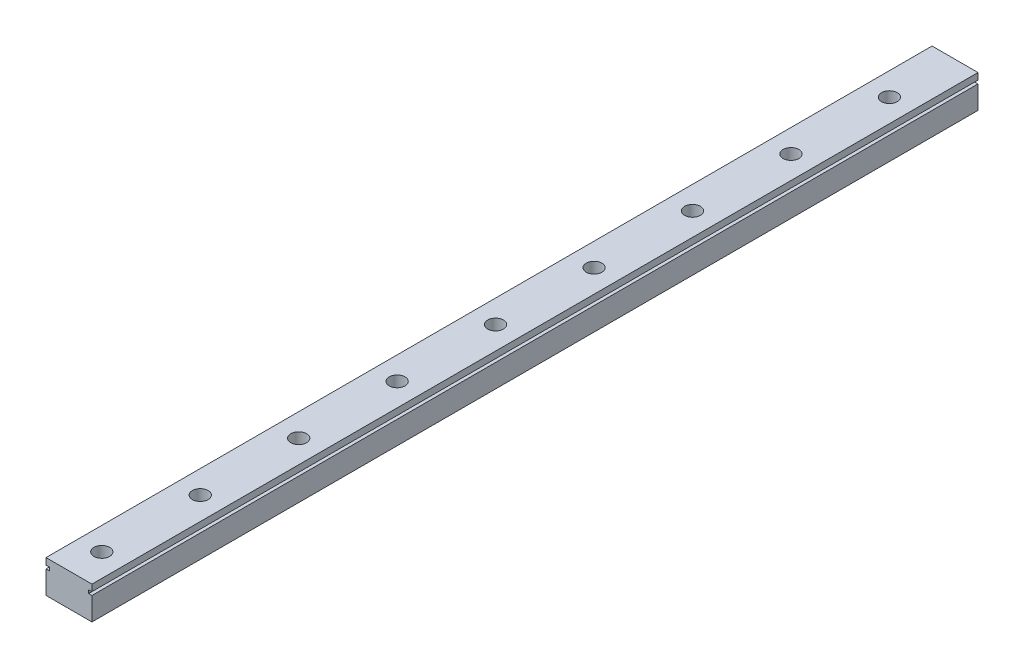
ISO-10303-21;
HEADER;
FILE_DESCRIPTION(('STEP AP214'),'2;1');
FILE_NAME('part.step','',(''),(''),'','','');
FILE_SCHEMA(('AUTOMOTIVE_DESIGN { 1 0 10303 214 1 1 1 1 }'));
ENDSEC;
DATA;
#1=APPLICATION_CONTEXT('core data for automotive mechanical design processes');
#2=APPLICATION_PROTOCOL_DEFINITION('international standard','automotive_design',2000,#1);
#3=PRODUCT_CONTEXT('',#1,'mechanical');
#4=PRODUCT('Part','Part','',(#3));
#5=PRODUCT_RELATED_PRODUCT_CATEGORY('part','',(#4));
#6=PRODUCT_DEFINITION_FORMATION('','',#4);
#7=PRODUCT_DEFINITION_CONTEXT('part definition',#1,'design');
#8=PRODUCT_DEFINITION('design','',#6,#7);
#9=PRODUCT_DEFINITION_SHAPE('','',#8);
#10=(LENGTH_UNIT() NAMED_UNIT(*) SI_UNIT(.MILLI.,.METRE.));
#11=(NAMED_UNIT(*) PLANE_ANGLE_UNIT() SI_UNIT($,.RADIAN.));
#12=(NAMED_UNIT(*) SI_UNIT($,.STERADIAN.) SOLID_ANGLE_UNIT());
#13=UNCERTAINTY_MEASURE_WITH_UNIT(LENGTH_MEASURE(1.E-05),#10,'distance_accuracy_value','');
#14=(GEOMETRIC_REPRESENTATION_CONTEXT(3) GLOBAL_UNCERTAINTY_ASSIGNED_CONTEXT((#13)) GLOBAL_UNIT_ASSIGNED_CONTEXT((#10,
#11,#12)) REPRESENTATION_CONTEXT('',''));
#15=CARTESIAN_POINT('',(0.,0.,0.));
#16=DIRECTION('',(0.,0.,1.));
#17=DIRECTION('',(1.,0.,0.));
#18=AXIS2_PLACEMENT_3D('',#15,#16,#17);
#19=CARTESIAN_POINT('',(0.,0.,135.));
#20=DIRECTION('',(1.,0.,0.));
#21=DIRECTION('',(0.,1.,0.));
#22=AXIS2_PLACEMENT_3D('',#19,#20,#21);
#23=PLANE('',#22);
#24=DIRECTION('',(0.,-1.,0.));
#25=VECTOR('',#24,1.);
#26=CARTESIAN_POINT('',(0.,0.,0.));
#27=LINE('',#26,#25);
#28=CARTESIAN_POINT('',(0.,3.5,0.));
#29=VERTEX_POINT('',#28);
#30=CARTESIAN_POINT('',(0.,0.,0.));
#31=VERTEX_POINT('',#30);
#32=EDGE_CURVE('E153',#29,#31,#27,.T.);
#33=ORIENTED_EDGE('',*,*,#32,.T.);
#34=DIRECTION('',(0.,0.,-1.));
#35=VECTOR('',#34,1.);
#36=CARTESIAN_POINT('',(0.,0.,135.));
#37=LINE('',#36,#35);
#38=CARTESIAN_POINT('',(0.,0.,135.));
#39=VERTEX_POINT('',#38);
#40=EDGE_CURVE('E11',#39,#31,#37,.T.);
#41=ORIENTED_EDGE('',*,*,#40,.F.);
#42=DIRECTION('',(0.,-1.,0.));
#43=VECTOR('',#42,1.);
#44=CARTESIAN_POINT('',(0.,0.,135.));
#45=LINE('',#44,#43);
#46=CARTESIAN_POINT('',(0.,3.5,135.));
#47=VERTEX_POINT('',#46);
#48=EDGE_CURVE('E176',#47,#39,#45,.T.);
#49=ORIENTED_EDGE('',*,*,#48,.F.);
#50=DIRECTION('',(0.,0.,-1.));
#51=VECTOR('',#50,1.);
#52=CARTESIAN_POINT('',(0.,3.5,135.));
#53=LINE('',#52,#51);
#54=EDGE_CURVE('E149',#47,#29,#53,.T.);
#55=ORIENTED_EDGE('',*,*,#54,.T.);
#56=EDGE_LOOP('',(#33,#41,#49,#55));
#57=FACE_BOUND('',#56,.T.);
#58=ADVANCED_FACE('F33',(#57),#23,.F.);
#59=CARTESIAN_POINT('',(0.,0.,135.));
#60=DIRECTION('',(0.,1.,0.));
#61=DIRECTION('',(0.,0.,1.));
#62=AXIS2_PLACEMENT_3D('',#59,#60,#61);
#63=PLANE('',#62);
#64=CARTESIAN_POINT('',(3.49999999999958,0.,10.));
#65=DIRECTION('',(0.,1.,0.));
#66=DIRECTION('',(0.,0.,1.));
#67=AXIS2_PLACEMENT_3D('',#64,#65,#66);
#68=CIRCLE('',#67,1.2);
#69=CARTESIAN_POINT('',(3.49999999999958,0.,11.2000000000001));
#70=VERTEX_POINT('',#69);
#71=EDGE_CURVE('E419',#70,#70,#68,.T.);
#72=ORIENTED_EDGE('',*,*,#71,.T.);
#73=EDGE_LOOP('',(#72));
#74=FACE_BOUND('',#73,.T.);
#75=CARTESIAN_POINT('',(3.49999999999963,0.,25.));
#76=DIRECTION('',(0.,1.,0.));
#77=DIRECTION('',(0.,0.,1.));
#78=AXIS2_PLACEMENT_3D('',#75,#76,#77);
#79=CIRCLE('',#78,1.2);
#80=CARTESIAN_POINT('',(3.49999999999963,0.,26.2));
#81=VERTEX_POINT('',#80);
#82=EDGE_CURVE('E427',#81,#81,#79,.T.);
#83=ORIENTED_EDGE('',*,*,#82,.T.);
#84=EDGE_LOOP('',(#83));
#85=FACE_BOUND('',#84,.T.);
#86=CARTESIAN_POINT('',(3.49999999999969,0.,40.));
#87=DIRECTION('',(0.,1.,0.));
#88=DIRECTION('',(0.,0.,1.));
#89=AXIS2_PLACEMENT_3D('',#86,#87,#88);
#90=CIRCLE('',#89,1.2);
#91=CARTESIAN_POINT('',(3.49999999999969,0.,41.2));
#92=VERTEX_POINT('',#91);
#93=EDGE_CURVE('E433',#92,#92,#90,.T.);
#94=ORIENTED_EDGE('',*,*,#93,.T.);
#95=EDGE_LOOP('',(#94));
#96=FACE_BOUND('',#95,.T.);
#97=CARTESIAN_POINT('',(3.49999999999974,0.,55.));
#98=DIRECTION('',(0.,1.,0.));
#99=DIRECTION('',(0.,0.,1.));
#100=AXIS2_PLACEMENT_3D('',#97,#98,#99);
#101=CIRCLE('',#100,1.2);
#102=CARTESIAN_POINT('',(3.49999999999974,0.,56.2));
#103=VERTEX_POINT('',#102);
#104=EDGE_CURVE('E439',#103,#103,#101,.T.);
#105=ORIENTED_EDGE('',*,*,#104,.T.);
#106=EDGE_LOOP('',(#105));
#107=FACE_BOUND('',#106,.T.);
#108=CARTESIAN_POINT('',(3.49999999999979,0.,70.));
#109=DIRECTION('',(0.,1.,0.));
#110=DIRECTION('',(0.,0.,1.));
#111=AXIS2_PLACEMENT_3D('',#108,#109,#110);
#112=CIRCLE('',#111,1.2);
#113=CARTESIAN_POINT('',(3.49999999999979,0.,71.2));
#114=VERTEX_POINT('',#113);
#115=EDGE_CURVE('E445',#114,#114,#112,.T.);
#116=ORIENTED_EDGE('',*,*,#115,.T.);
#117=EDGE_LOOP('',(#116));
#118=FACE_BOUND('',#117,.T.);
#119=CARTESIAN_POINT('',(3.49999999999984,0.,85.));
#120=DIRECTION('',(0.,1.,0.));
#121=DIRECTION('',(0.,0.,1.));
#122=AXIS2_PLACEMENT_3D('',#119,#120,#121);
#123=CIRCLE('',#122,1.2);
#124=CARTESIAN_POINT('',(3.49999999999984,0.,86.2));
#125=VERTEX_POINT('',#124);
#126=EDGE_CURVE('E451',#125,#125,#123,.T.);
#127=ORIENTED_EDGE('',*,*,#126,.T.);
#128=EDGE_LOOP('',(#127));
#129=FACE_BOUND('',#128,.T.);
#130=CARTESIAN_POINT('',(3.49999999999989,0.,100.));
#131=DIRECTION('',(0.,1.,0.));
#132=DIRECTION('',(0.,0.,1.));
#133=AXIS2_PLACEMENT_3D('',#130,#131,#132);
#134=CIRCLE('',#133,1.2);
#135=CARTESIAN_POINT('',(3.49999999999989,0.,101.2));
#136=VERTEX_POINT('',#135);
#137=EDGE_CURVE('E457',#136,#136,#134,.T.);
#138=ORIENTED_EDGE('',*,*,#137,.T.);
#139=EDGE_LOOP('',(#138));
#140=FACE_BOUND('',#139,.T.);
#141=CARTESIAN_POINT('',(3.49999999999995,0.,115.));
#142=DIRECTION('',(0.,1.,0.));
#143=DIRECTION('',(0.,0.,1.));
#144=AXIS2_PLACEMENT_3D('',#141,#142,#143);
#145=CIRCLE('',#144,1.2);
#146=CARTESIAN_POINT('',(3.49999999999995,0.,116.2));
#147=VERTEX_POINT('',#146);
#148=EDGE_CURVE('E463',#147,#147,#145,.T.);
#149=ORIENTED_EDGE('',*,*,#148,.T.);
#150=EDGE_LOOP('',(#149));
#151=FACE_BOUND('',#150,.T.);
#152=CARTESIAN_POINT('',(3.5,0.,130.));
#153=DIRECTION('',(0.,1.,0.));
#154=DIRECTION('',(0.,0.,1.));
#155=AXIS2_PLACEMENT_3D('',#152,#153,#154);
#156=CIRCLE('',#155,1.2);
#157=CARTESIAN_POINT('',(3.5,0.,131.2));
#158=VERTEX_POINT('',#157);
#159=EDGE_CURVE('E157',#158,#158,#156,.T.);
#160=ORIENTED_EDGE('',*,*,#159,.T.);
#161=EDGE_LOOP('',(#160));
#162=FACE_BOUND('',#161,.T.);
#163=DIRECTION('',(1.,0.,0.));
#164=VECTOR('',#163,1.);
#165=CARTESIAN_POINT('',(0.,0.,0.));
#166=LINE('',#165,#164);
#167=CARTESIAN_POINT('',(7.,0.,0.));
#168=VERTEX_POINT('',#167);
#169=EDGE_CURVE('E156',#31,#168,#166,.T.);
#170=ORIENTED_EDGE('',*,*,#169,.T.);
#171=DIRECTION('',(0.,0.,-1.));
#172=VECTOR('',#171,1.);
#173=CARTESIAN_POINT('',(7.,0.,135.));
#174=LINE('',#173,#172);
#175=CARTESIAN_POINT('',(7.,0.,135.));
#176=VERTEX_POINT('',#175);
#177=EDGE_CURVE('E41',#176,#168,#174,.T.);
#178=ORIENTED_EDGE('',*,*,#177,.F.);
#179=DIRECTION('',(1.,0.,0.));
#180=VECTOR('',#179,1.);
#181=CARTESIAN_POINT('',(0.,0.,135.));
#182=LINE('',#181,#180);
#183=EDGE_CURVE('E104',#39,#176,#182,.T.);
#184=ORIENTED_EDGE('',*,*,#183,.F.);
#185=ORIENTED_EDGE('',*,*,#40,.T.);
#186=EDGE_LOOP('',(#170,#178,#184,#185));
#187=FACE_BOUND('',#186,.T.);
#188=ADVANCED_FACE('F254',(#74,#85,#96,#107,#118,#129,#140,#151,#162,#187),#63,.F.);
#189=CARTESIAN_POINT('',(7.,0.,135.));
#190=DIRECTION('',(-1.,0.,0.));
#191=DIRECTION('',(0.,0.,1.));
#192=AXIS2_PLACEMENT_3D('',#189,#190,#191);
#193=PLANE('',#192);
#194=DIRECTION('',(0.,1.,0.));
#195=VECTOR('',#194,1.);
#196=CARTESIAN_POINT('',(7.,0.,0.));
#197=LINE('',#196,#195);
#198=CARTESIAN_POINT('',(7.,3.5,0.));
#199=VERTEX_POINT('',#198);
#200=EDGE_CURVE('E159',#168,#199,#197,.T.);
#201=ORIENTED_EDGE('',*,*,#200,.T.);
#202=DIRECTION('',(0.,0.,-1.));
#203=VECTOR('',#202,1.);
#204=CARTESIAN_POINT('',(7.,3.5,135.));
#205=LINE('',#204,#203);
#206=CARTESIAN_POINT('',(7.,3.5,135.));
#207=VERTEX_POINT('',#206);
#208=EDGE_CURVE('E195',#207,#199,#205,.T.);
#209=ORIENTED_EDGE('',*,*,#208,.F.);
#210=DIRECTION('',(0.,1.,0.));
#211=VECTOR('',#210,1.);
#212=CARTESIAN_POINT('',(7.,0.,135.));
#213=LINE('',#212,#211);
#214=EDGE_CURVE('E203',#176,#207,#213,.T.);
#215=ORIENTED_EDGE('',*,*,#214,.F.);
#216=ORIENTED_EDGE('',*,*,#177,.T.);
#217=EDGE_LOOP('',(#201,#209,#215,#216));
#218=FACE_BOUND('',#217,.T.);
#219=ADVANCED_FACE('F201',(#218),#193,.F.);
#220=CARTESIAN_POINT('',(7.,3.5,135.));
#221=DIRECTION('',(0.,-1.,0.));
#222=DIRECTION('',(0.,0.,-1.));
#223=AXIS2_PLACEMENT_3D('',#220,#221,#222);
#224=PLANE('',#223);
#225=DIRECTION('',(-1.,0.,0.));
#226=VECTOR('',#225,1.);
#227=CARTESIAN_POINT('',(7.,3.5,0.));
#228=LINE('',#227,#226);
#229=CARTESIAN_POINT('',(6.5,3.5,0.));
#230=VERTEX_POINT('',#229);
#231=EDGE_CURVE('E161',#199,#230,#228,.T.);
#232=ORIENTED_EDGE('',*,*,#231,.T.);
#233=DIRECTION('',(0.,0.,-1.));
#234=VECTOR('',#233,1.);
#235=CARTESIAN_POINT('',(6.5,3.5,135.));
#236=LINE('',#235,#234);
#237=CARTESIAN_POINT('',(6.5,3.5,135.));
#238=VERTEX_POINT('',#237);
#239=EDGE_CURVE('E192',#238,#230,#236,.T.);
#240=ORIENTED_EDGE('',*,*,#239,.F.);
#241=DIRECTION('',(-1.,0.,0.));
#242=VECTOR('',#241,1.);
#243=CARTESIAN_POINT('',(7.,3.5,135.));
#244=LINE('',#243,#242);
#245=EDGE_CURVE('E221',#207,#238,#244,.T.);
#246=ORIENTED_EDGE('',*,*,#245,.F.);
#247=ORIENTED_EDGE('',*,*,#208,.T.);
#248=EDGE_LOOP('',(#232,#240,#246,#247));
#249=FACE_BOUND('',#248,.T.);
#250=ADVANCED_FACE('F212',(#249),#224,.F.);
#251=CARTESIAN_POINT('',(6.5,4.,135.));
#252=DIRECTION('',(-1.,0.,0.));
#253=DIRECTION('',(0.,0.,1.));
#254=AXIS2_PLACEMENT_3D('',#251,#252,#253);
#255=PLANE('',#254);
#256=DIRECTION('',(0.,1.,0.));
#257=VECTOR('',#256,1.);
#258=CARTESIAN_POINT('',(6.5,4.,0.));
#259=LINE('',#258,#257);
#260=CARTESIAN_POINT('',(6.5,4.,0.));
#261=VERTEX_POINT('',#260);
#262=EDGE_CURVE('E163',#230,#261,#259,.T.);
#263=ORIENTED_EDGE('',*,*,#262,.T.);
#264=DIRECTION('',(0.,0.,-1.));
#265=VECTOR('',#264,1.);
#266=CARTESIAN_POINT('',(6.5,4.,135.));
#267=LINE('',#266,#265);
#268=CARTESIAN_POINT('',(6.5,4.,135.));
#269=VERTEX_POINT('',#268);
#270=EDGE_CURVE('E189',#269,#261,#267,.T.);
#271=ORIENTED_EDGE('',*,*,#270,.F.);
#272=DIRECTION('',(0.,1.,0.));
#273=VECTOR('',#272,1.);
#274=CARTESIAN_POINT('',(6.5,4.,135.));
#275=LINE('',#274,#273);
#276=EDGE_CURVE('E218',#238,#269,#275,.T.);
#277=ORIENTED_EDGE('',*,*,#276,.F.);
#278=ORIENTED_EDGE('',*,*,#239,.T.);
#279=EDGE_LOOP('',(#263,#271,#277,#278));
#280=FACE_BOUND('',#279,.T.);
#281=ADVANCED_FACE('F216',(#280),#255,.F.);
#282=CARTESIAN_POINT('',(7.,4.,135.));
#283=DIRECTION('',(0.,1.,0.));
#284=DIRECTION('',(0.,0.,1.));
#285=AXIS2_PLACEMENT_3D('',#282,#283,#284);
#286=PLANE('',#285);
#287=DIRECTION('',(1.,0.,0.));
#288=VECTOR('',#287,1.);
#289=CARTESIAN_POINT('',(7.,4.,0.));
#290=LINE('',#289,#288);
#291=CARTESIAN_POINT('',(7.,4.,0.));
#292=VERTEX_POINT('',#291);
#293=EDGE_CURVE('E165',#261,#292,#290,.T.);
#294=ORIENTED_EDGE('',*,*,#293,.T.);
#295=DIRECTION('',(0.,0.,-1.));
#296=VECTOR('',#295,1.);
#297=CARTESIAN_POINT('',(7.,4.,135.));
#298=LINE('',#297,#296);
#299=CARTESIAN_POINT('',(7.,4.,135.));
#300=VERTEX_POINT('',#299);
#301=EDGE_CURVE('E186',#300,#292,#298,.T.);
#302=ORIENTED_EDGE('',*,*,#301,.F.);
#303=DIRECTION('',(1.,0.,0.));
#304=VECTOR('',#303,1.);
#305=CARTESIAN_POINT('',(7.,4.,135.));
#306=LINE('',#305,#304);
#307=EDGE_CURVE('E220',#269,#300,#306,.T.);
#308=ORIENTED_EDGE('',*,*,#307,.F.);
#309=ORIENTED_EDGE('',*,*,#270,.T.);
#310=EDGE_LOOP('',(#294,#302,#308,#309));
#311=FACE_BOUND('',#310,.T.);
#312=ADVANCED_FACE('F270',(#311),#286,.F.);
#313=CARTESIAN_POINT('',(7.,4.,135.));
#314=DIRECTION('',(-1.,0.,0.));
#315=DIRECTION('',(0.,0.,1.));
#316=AXIS2_PLACEMENT_3D('',#313,#314,#315);
#317=PLANE('',#316);
#318=DIRECTION('',(0.,1.,0.));
#319=VECTOR('',#318,1.);
#320=CARTESIAN_POINT('',(7.,4.,0.));
#321=LINE('',#320,#319);
#322=CARTESIAN_POINT('',(7.,5.,0.));
#323=VERTEX_POINT('',#322);
#324=EDGE_CURVE('E167',#292,#323,#321,.T.);
#325=ORIENTED_EDGE('',*,*,#324,.T.);
#326=DIRECTION('',(0.,0.,-1.));
#327=VECTOR('',#326,1.);
#328=CARTESIAN_POINT('',(7.,5.,135.));
#329=LINE('',#328,#327);
#330=CARTESIAN_POINT('',(7.,5.,135.));
#331=VERTEX_POINT('',#330);
#332=EDGE_CURVE('E183',#331,#323,#329,.T.);
#333=ORIENTED_EDGE('',*,*,#332,.F.);
#334=DIRECTION('',(0.,1.,0.));
#335=VECTOR('',#334,1.);
#336=CARTESIAN_POINT('',(7.,4.,135.));
#337=LINE('',#336,#335);
#338=EDGE_CURVE('E223',#300,#331,#337,.T.);
#339=ORIENTED_EDGE('',*,*,#338,.F.);
#340=ORIENTED_EDGE('',*,*,#301,.T.);
#341=EDGE_LOOP('',(#325,#333,#339,#340));
#342=FACE_BOUND('',#341,.T.);
#343=ADVANCED_FACE('F273',(#342),#317,.F.);
#344=CARTESIAN_POINT('',(0.,5.,135.));
#345=DIRECTION('',(0.,-1.,0.));
#346=DIRECTION('',(0.,0.,-1.));
#347=AXIS2_PLACEMENT_3D('',#344,#345,#346);
#348=PLANE('',#347);
#349=CARTESIAN_POINT('',(3.49999999999958,5.,10.));
#350=DIRECTION('',(0.,1.,0.));
#351=DIRECTION('',(0.,0.,1.));
#352=AXIS2_PLACEMENT_3D('',#349,#350,#351);
#353=CIRCLE('',#352,1.2);
#354=CARTESIAN_POINT('',(3.49999999999958,5.,11.2000000000001));
#355=VERTEX_POINT('',#354);
#356=EDGE_CURVE('E422',#355,#355,#353,.T.);
#357=ORIENTED_EDGE('',*,*,#356,.F.);
#358=EDGE_LOOP('',(#357));
#359=FACE_BOUND('',#358,.T.);
#360=CARTESIAN_POINT('',(3.49999999999963,5.,25.));
#361=DIRECTION('',(0.,1.,0.));
#362=DIRECTION('',(0.,0.,1.));
#363=AXIS2_PLACEMENT_3D('',#360,#361,#362);
#364=CIRCLE('',#363,1.2);
#365=CARTESIAN_POINT('',(3.49999999999963,5.,26.2));
#366=VERTEX_POINT('',#365);
#367=EDGE_CURVE('E424',#366,#366,#364,.T.);
#368=ORIENTED_EDGE('',*,*,#367,.F.);
#369=EDGE_LOOP('',(#368));
#370=FACE_BOUND('',#369,.T.);
#371=CARTESIAN_POINT('',(3.49999999999969,5.,40.));
#372=DIRECTION('',(0.,1.,0.));
#373=DIRECTION('',(0.,0.,1.));
#374=AXIS2_PLACEMENT_3D('',#371,#372,#373);
#375=CIRCLE('',#374,1.2);
#376=CARTESIAN_POINT('',(3.49999999999969,5.,41.2));
#377=VERTEX_POINT('',#376);
#378=EDGE_CURVE('E430',#377,#377,#375,.T.);
#379=ORIENTED_EDGE('',*,*,#378,.F.);
#380=EDGE_LOOP('',(#379));
#381=FACE_BOUND('',#380,.T.);
#382=CARTESIAN_POINT('',(3.49999999999974,5.,55.));
#383=DIRECTION('',(0.,1.,0.));
#384=DIRECTION('',(0.,0.,1.));
#385=AXIS2_PLACEMENT_3D('',#382,#383,#384);
#386=CIRCLE('',#385,1.2);
#387=CARTESIAN_POINT('',(3.49999999999974,5.,56.2));
#388=VERTEX_POINT('',#387);
#389=EDGE_CURVE('E436',#388,#388,#386,.T.);
#390=ORIENTED_EDGE('',*,*,#389,.F.);
#391=EDGE_LOOP('',(#390));
#392=FACE_BOUND('',#391,.T.);
#393=CARTESIAN_POINT('',(3.49999999999979,5.,70.));
#394=DIRECTION('',(0.,1.,0.));
#395=DIRECTION('',(0.,0.,1.));
#396=AXIS2_PLACEMENT_3D('',#393,#394,#395);
#397=CIRCLE('',#396,1.2);
#398=CARTESIAN_POINT('',(3.49999999999979,5.,71.2));
#399=VERTEX_POINT('',#398);
#400=EDGE_CURVE('E442',#399,#399,#397,.T.);
#401=ORIENTED_EDGE('',*,*,#400,.F.);
#402=EDGE_LOOP('',(#401));
#403=FACE_BOUND('',#402,.T.);
#404=CARTESIAN_POINT('',(3.49999999999984,5.,85.));
#405=DIRECTION('',(0.,1.,0.));
#406=DIRECTION('',(0.,0.,1.));
#407=AXIS2_PLACEMENT_3D('',#404,#405,#406);
#408=CIRCLE('',#407,1.2);
#409=CARTESIAN_POINT('',(3.49999999999984,5.,86.2));
#410=VERTEX_POINT('',#409);
#411=EDGE_CURVE('E448',#410,#410,#408,.T.);
#412=ORIENTED_EDGE('',*,*,#411,.F.);
#413=EDGE_LOOP('',(#412));
#414=FACE_BOUND('',#413,.T.);
#415=CARTESIAN_POINT('',(3.49999999999989,5.,100.));
#416=DIRECTION('',(0.,1.,0.));
#417=DIRECTION('',(0.,0.,1.));
#418=AXIS2_PLACEMENT_3D('',#415,#416,#417);
#419=CIRCLE('',#418,1.2);
#420=CARTESIAN_POINT('',(3.49999999999989,5.,101.2));
#421=VERTEX_POINT('',#420);
#422=EDGE_CURVE('E454',#421,#421,#419,.T.);
#423=ORIENTED_EDGE('',*,*,#422,.F.);
#424=EDGE_LOOP('',(#423));
#425=FACE_BOUND('',#424,.T.);
#426=CARTESIAN_POINT('',(3.49999999999995,5.,115.));
#427=DIRECTION('',(0.,1.,0.));
#428=DIRECTION('',(0.,0.,1.));
#429=AXIS2_PLACEMENT_3D('',#426,#427,#428);
#430=CIRCLE('',#429,1.2);
#431=CARTESIAN_POINT('',(3.49999999999995,5.,116.2));
#432=VERTEX_POINT('',#431);
#433=EDGE_CURVE('E460',#432,#432,#430,.T.);
#434=ORIENTED_EDGE('',*,*,#433,.F.);
#435=EDGE_LOOP('',(#434));
#436=FACE_BOUND('',#435,.T.);
#437=CARTESIAN_POINT('',(3.5,5.,130.));
#438=DIRECTION('',(0.,1.,0.));
#439=DIRECTION('',(0.,0.,1.));
#440=AXIS2_PLACEMENT_3D('',#437,#438,#439);
#441=CIRCLE('',#440,1.2);
#442=CARTESIAN_POINT('',(3.5,5.,131.2));
#443=VERTEX_POINT('',#442);
#444=EDGE_CURVE('E466',#443,#443,#441,.T.);
#445=ORIENTED_EDGE('',*,*,#444,.F.);
#446=EDGE_LOOP('',(#445));
#447=FACE_BOUND('',#446,.T.);
#448=DIRECTION('',(-1.,0.,0.));
#449=VECTOR('',#448,1.);
#450=CARTESIAN_POINT('',(0.,5.,0.));
#451=LINE('',#450,#449);
#452=CARTESIAN_POINT('',(0.,5.,0.));
#453=VERTEX_POINT('',#452);
#454=EDGE_CURVE('E169',#323,#453,#451,.T.);
#455=ORIENTED_EDGE('',*,*,#454,.T.);
#456=DIRECTION('',(0.,0.,-1.));
#457=VECTOR('',#456,1.);
#458=CARTESIAN_POINT('',(0.,5.,135.));
#459=LINE('',#458,#457);
#460=CARTESIAN_POINT('',(0.,5.,135.));
#461=VERTEX_POINT('',#460);
#462=EDGE_CURVE('E180',#461,#453,#459,.T.);
#463=ORIENTED_EDGE('',*,*,#462,.F.);
#464=DIRECTION('',(-1.,0.,0.));
#465=VECTOR('',#464,1.);
#466=CARTESIAN_POINT('',(0.,5.,135.));
#467=LINE('',#466,#465);
#468=EDGE_CURVE('E229',#331,#461,#467,.T.);
#469=ORIENTED_EDGE('',*,*,#468,.F.);
#470=ORIENTED_EDGE('',*,*,#332,.T.);
#471=EDGE_LOOP('',(#455,#463,#469,#470));
#472=FACE_BOUND('',#471,.T.);
#473=ADVANCED_FACE('F235',(#359,#370,#381,#392,#403,#414,#425,#436,#447,#472),#348,.F.);
#474=CARTESIAN_POINT('',(0.,4.,135.));
#475=DIRECTION('',(1.,0.,0.));
#476=DIRECTION('',(0.,1.,0.));
#477=AXIS2_PLACEMENT_3D('',#474,#475,#476);
#478=PLANE('',#477);
#479=DIRECTION('',(0.,-1.,0.));
#480=VECTOR('',#479,1.);
#481=CARTESIAN_POINT('',(0.,4.,0.));
#482=LINE('',#481,#480);
#483=CARTESIAN_POINT('',(0.,4.,0.));
#484=VERTEX_POINT('',#483);
#485=EDGE_CURVE('E171',#453,#484,#482,.T.);
#486=ORIENTED_EDGE('',*,*,#485,.T.);
#487=DIRECTION('',(0.,0.,-1.));
#488=VECTOR('',#487,1.);
#489=CARTESIAN_POINT('',(0.,4.,135.));
#490=LINE('',#489,#488);
#491=CARTESIAN_POINT('',(0.,4.,135.));
#492=VERTEX_POINT('',#491);
#493=EDGE_CURVE('E144',#492,#484,#490,.T.);
#494=ORIENTED_EDGE('',*,*,#493,.F.);
#495=DIRECTION('',(0.,-1.,0.));
#496=VECTOR('',#495,1.);
#497=CARTESIAN_POINT('',(0.,4.,135.));
#498=LINE('',#497,#496);
#499=EDGE_CURVE('E135',#461,#492,#498,.T.);
#500=ORIENTED_EDGE('',*,*,#499,.F.);
#501=ORIENTED_EDGE('',*,*,#462,.T.);
#502=EDGE_LOOP('',(#486,#494,#500,#501));
#503=FACE_BOUND('',#502,.T.);
#504=ADVANCED_FACE('F239',(#503),#478,.F.);
#505=CARTESIAN_POINT('',(0.,4.,135.));
#506=DIRECTION('',(0.,1.,0.));
#507=DIRECTION('',(0.,0.,1.));
#508=AXIS2_PLACEMENT_3D('',#505,#506,#507);
#509=PLANE('',#508);
#510=DIRECTION('',(1.,0.,0.));
#511=VECTOR('',#510,1.);
#512=CARTESIAN_POINT('',(0.,4.,0.));
#513=LINE('',#512,#511);
#514=CARTESIAN_POINT('',(0.5,4.,0.));
#515=VERTEX_POINT('',#514);
#516=EDGE_CURVE('E143',#484,#515,#513,.T.);
#517=ORIENTED_EDGE('',*,*,#516,.T.);
#518=DIRECTION('',(0.,0.,-1.));
#519=VECTOR('',#518,1.);
#520=CARTESIAN_POINT('',(0.5,4.,135.));
#521=LINE('',#520,#519);
#522=CARTESIAN_POINT('',(0.5,4.,135.));
#523=VERTEX_POINT('',#522);
#524=EDGE_CURVE('E140',#523,#515,#521,.T.);
#525=ORIENTED_EDGE('',*,*,#524,.F.);
#526=DIRECTION('',(1.,0.,0.));
#527=VECTOR('',#526,1.);
#528=CARTESIAN_POINT('',(0.,4.,135.));
#529=LINE('',#528,#527);
#530=EDGE_CURVE('E129',#492,#523,#529,.T.);
#531=ORIENTED_EDGE('',*,*,#530,.F.);
#532=ORIENTED_EDGE('',*,*,#493,.T.);
#533=EDGE_LOOP('',(#517,#525,#531,#532));
#534=FACE_BOUND('',#533,.T.);
#535=ADVANCED_FACE('F141',(#534),#509,.F.);
#536=CARTESIAN_POINT('',(0.5,4.,135.));
#537=DIRECTION('',(1.,0.,0.));
#538=DIRECTION('',(0.,1.,0.));
#539=AXIS2_PLACEMENT_3D('',#536,#537,#538);
#540=PLANE('',#539);
#541=DIRECTION('',(0.,-1.,0.));
#542=VECTOR('',#541,1.);
#543=CARTESIAN_POINT('',(0.5,4.,0.));
#544=LINE('',#543,#542);
#545=CARTESIAN_POINT('',(0.5,3.5,0.));
#546=VERTEX_POINT('',#545);
#547=EDGE_CURVE('E90',#515,#546,#544,.T.);
#548=ORIENTED_EDGE('',*,*,#547,.T.);
#549=DIRECTION('',(0.,0.,-1.));
#550=VECTOR('',#549,1.);
#551=CARTESIAN_POINT('',(0.5,3.5,135.));
#552=LINE('',#551,#550);
#553=CARTESIAN_POINT('',(0.5,3.5,135.));
#554=VERTEX_POINT('',#553);
#555=EDGE_CURVE('E145',#554,#546,#552,.T.);
#556=ORIENTED_EDGE('',*,*,#555,.F.);
#557=DIRECTION('',(0.,-1.,0.));
#558=VECTOR('',#557,1.);
#559=CARTESIAN_POINT('',(0.5,4.,135.));
#560=LINE('',#559,#558);
#561=EDGE_CURVE('E133',#523,#554,#560,.T.);
#562=ORIENTED_EDGE('',*,*,#561,.F.);
#563=ORIENTED_EDGE('',*,*,#524,.T.);
#564=EDGE_LOOP('',(#548,#556,#562,#563));
#565=FACE_BOUND('',#564,.T.);
#566=ADVANCED_FACE('F147',(#565),#540,.F.);
#567=CARTESIAN_POINT('',(0.,3.5,135.));
#568=DIRECTION('',(0.,-1.,0.));
#569=DIRECTION('',(0.,0.,-1.));
#570=AXIS2_PLACEMENT_3D('',#567,#568,#569);
#571=PLANE('',#570);
#572=DIRECTION('',(-1.,0.,0.));
#573=VECTOR('',#572,1.);
#574=CARTESIAN_POINT('',(0.,3.5,0.));
#575=LINE('',#574,#573);
#576=EDGE_CURVE('E96',#546,#29,#575,.T.);
#577=ORIENTED_EDGE('',*,*,#576,.T.);
#578=ORIENTED_EDGE('',*,*,#54,.F.);
#579=DIRECTION('',(-1.,0.,0.));
#580=VECTOR('',#579,1.);
#581=CARTESIAN_POINT('',(0.,3.5,135.));
#582=LINE('',#581,#580);
#583=EDGE_CURVE('E49',#554,#47,#582,.T.);
#584=ORIENTED_EDGE('',*,*,#583,.F.);
#585=ORIENTED_EDGE('',*,*,#555,.T.);
#586=EDGE_LOOP('',(#577,#578,#584,#585));
#587=FACE_BOUND('',#586,.T.);
#588=ADVANCED_FACE('F243',(#587),#571,.F.);
#589=CARTESIAN_POINT('',(0.,0.,135.));
#590=DIRECTION('',(0.,0.,-1.));
#591=DIRECTION('',(-1.,0.,0.));
#592=AXIS2_PLACEMENT_3D('',#589,#590,#591);
#593=PLANE('',#592);
#594=ORIENTED_EDGE('',*,*,#48,.T.);
#595=ORIENTED_EDGE('',*,*,#183,.T.);
#596=ORIENTED_EDGE('',*,*,#214,.T.);
#597=ORIENTED_EDGE('',*,*,#245,.T.);
#598=ORIENTED_EDGE('',*,*,#276,.T.);
#599=ORIENTED_EDGE('',*,*,#307,.T.);
#600=ORIENTED_EDGE('',*,*,#338,.T.);
#601=ORIENTED_EDGE('',*,*,#468,.T.);
#602=ORIENTED_EDGE('',*,*,#499,.T.);
#603=ORIENTED_EDGE('',*,*,#530,.T.);
#604=ORIENTED_EDGE('',*,*,#561,.T.);
#605=ORIENTED_EDGE('',*,*,#583,.T.);
#606=EDGE_LOOP('',(#594,#595,#596,#597,#598,#599,#600,#601,#602,#603,#604,#605));
#607=FACE_BOUND('',#606,.T.);
#608=ADVANCED_FACE('F131',(#607),#593,.F.);
#609=CARTESIAN_POINT('',(0.,0.,0.));
#610=DIRECTION('',(0.,0.,-1.));
#611=DIRECTION('',(-1.,0.,0.));
#612=AXIS2_PLACEMENT_3D('',#609,#610,#611);
#613=PLANE('',#612);
#614=ORIENTED_EDGE('',*,*,#32,.F.);
#615=ORIENTED_EDGE('',*,*,#576,.F.);
#616=ORIENTED_EDGE('',*,*,#547,.F.);
#617=ORIENTED_EDGE('',*,*,#516,.F.);
#618=ORIENTED_EDGE('',*,*,#485,.F.);
#619=ORIENTED_EDGE('',*,*,#454,.F.);
#620=ORIENTED_EDGE('',*,*,#324,.F.);
#621=ORIENTED_EDGE('',*,*,#293,.F.);
#622=ORIENTED_EDGE('',*,*,#262,.F.);
#623=ORIENTED_EDGE('',*,*,#231,.F.);
#624=ORIENTED_EDGE('',*,*,#200,.F.);
#625=ORIENTED_EDGE('',*,*,#169,.F.);
#626=EDGE_LOOP('',(#614,#615,#616,#617,#618,#619,#620,#621,#622,#623,#624,#625));
#627=FACE_BOUND('',#626,.T.);
#628=ADVANCED_FACE('F207',(#627),#613,.T.);
#629=CARTESIAN_POINT('',(3.5,0.,130.));
#630=DIRECTION('',(0.,1.,0.));
#631=DIRECTION('',(0.,0.,1.));
#632=AXIS2_PLACEMENT_3D('',#629,#630,#631);
#633=CYLINDRICAL_SURFACE('',#632,1.2);
#634=ORIENTED_EDGE('',*,*,#159,.F.);
#635=EDGE_LOOP('',(#634));
#636=FACE_BOUND('',#635,.T.);
#637=ORIENTED_EDGE('',*,*,#444,.T.);
#638=EDGE_LOOP('',(#637));
#639=FACE_BOUND('',#638,.T.);
#640=ADVANCED_FACE('F310',(#636,#639),#633,.F.);
#641=CARTESIAN_POINT('',(3.49999999999995,0.,115.));
#642=DIRECTION('',(0.,1.,0.));
#643=DIRECTION('',(0.,0.,1.));
#644=AXIS2_PLACEMENT_3D('',#641,#642,#643);
#645=CYLINDRICAL_SURFACE('',#644,1.2);
#646=ORIENTED_EDGE('',*,*,#148,.F.);
#647=EDGE_LOOP('',(#646));
#648=FACE_BOUND('',#647,.T.);
#649=ORIENTED_EDGE('',*,*,#433,.T.);
#650=EDGE_LOOP('',(#649));
#651=FACE_BOUND('',#650,.T.);
#652=ADVANCED_FACE('F333',(#648,#651),#645,.F.);
#653=CARTESIAN_POINT('',(3.49999999999989,0.,100.));
#654=DIRECTION('',(0.,1.,0.));
#655=DIRECTION('',(0.,0.,1.));
#656=AXIS2_PLACEMENT_3D('',#653,#654,#655);
#657=CYLINDRICAL_SURFACE('',#656,1.2);
#658=ORIENTED_EDGE('',*,*,#137,.F.);
#659=EDGE_LOOP('',(#658));
#660=FACE_BOUND('',#659,.T.);
#661=ORIENTED_EDGE('',*,*,#422,.T.);
#662=EDGE_LOOP('',(#661));
#663=FACE_BOUND('',#662,.T.);
#664=ADVANCED_FACE('F343',(#660,#663),#657,.F.);
#665=CARTESIAN_POINT('',(3.49999999999984,0.,85.));
#666=DIRECTION('',(0.,1.,0.));
#667=DIRECTION('',(0.,0.,1.));
#668=AXIS2_PLACEMENT_3D('',#665,#666,#667);
#669=CYLINDRICAL_SURFACE('',#668,1.2);
#670=ORIENTED_EDGE('',*,*,#126,.F.);
#671=EDGE_LOOP('',(#670));
#672=FACE_BOUND('',#671,.T.);
#673=ORIENTED_EDGE('',*,*,#411,.T.);
#674=EDGE_LOOP('',(#673));
#675=FACE_BOUND('',#674,.T.);
#676=ADVANCED_FACE('F353',(#672,#675),#669,.F.);
#677=CARTESIAN_POINT('',(3.49999999999979,0.,70.));
#678=DIRECTION('',(0.,1.,0.));
#679=DIRECTION('',(0.,0.,1.));
#680=AXIS2_PLACEMENT_3D('',#677,#678,#679);
#681=CYLINDRICAL_SURFACE('',#680,1.2);
#682=ORIENTED_EDGE('',*,*,#115,.F.);
#683=EDGE_LOOP('',(#682));
#684=FACE_BOUND('',#683,.T.);
#685=ORIENTED_EDGE('',*,*,#400,.T.);
#686=EDGE_LOOP('',(#685));
#687=FACE_BOUND('',#686,.T.);
#688=ADVANCED_FACE('F363',(#684,#687),#681,.F.);
#689=CARTESIAN_POINT('',(3.49999999999974,0.,55.));
#690=DIRECTION('',(0.,1.,0.));
#691=DIRECTION('',(0.,0.,1.));
#692=AXIS2_PLACEMENT_3D('',#689,#690,#691);
#693=CYLINDRICAL_SURFACE('',#692,1.2);
#694=ORIENTED_EDGE('',*,*,#104,.F.);
#695=EDGE_LOOP('',(#694));
#696=FACE_BOUND('',#695,.T.);
#697=ORIENTED_EDGE('',*,*,#389,.T.);
#698=EDGE_LOOP('',(#697));
#699=FACE_BOUND('',#698,.T.);
#700=ADVANCED_FACE('F373',(#696,#699),#693,.F.);
#701=CARTESIAN_POINT('',(3.49999999999969,0.,40.));
#702=DIRECTION('',(0.,1.,0.));
#703=DIRECTION('',(0.,0.,1.));
#704=AXIS2_PLACEMENT_3D('',#701,#702,#703);
#705=CYLINDRICAL_SURFACE('',#704,1.2);
#706=ORIENTED_EDGE('',*,*,#93,.F.);
#707=EDGE_LOOP('',(#706));
#708=FACE_BOUND('',#707,.T.);
#709=ORIENTED_EDGE('',*,*,#378,.T.);
#710=EDGE_LOOP('',(#709));
#711=FACE_BOUND('',#710,.T.);
#712=ADVANCED_FACE('F383',(#708,#711),#705,.F.);
#713=CARTESIAN_POINT('',(3.49999999999963,0.,25.));
#714=DIRECTION('',(0.,1.,0.));
#715=DIRECTION('',(0.,0.,1.));
#716=AXIS2_PLACEMENT_3D('',#713,#714,#715);
#717=CYLINDRICAL_SURFACE('',#716,1.2);
#718=ORIENTED_EDGE('',*,*,#82,.F.);
#719=EDGE_LOOP('',(#718));
#720=FACE_BOUND('',#719,.T.);
#721=ORIENTED_EDGE('',*,*,#367,.T.);
#722=EDGE_LOOP('',(#721));
#723=FACE_BOUND('',#722,.T.);
#724=ADVANCED_FACE('F393',(#720,#723),#717,.F.);
#725=CARTESIAN_POINT('',(3.49999999999958,0.,10.));
#726=DIRECTION('',(0.,1.,0.));
#727=DIRECTION('',(0.,0.,1.));
#728=AXIS2_PLACEMENT_3D('',#725,#726,#727);
#729=CYLINDRICAL_SURFACE('',#728,1.2);
#730=ORIENTED_EDGE('',*,*,#71,.F.);
#731=EDGE_LOOP('',(#730));
#732=FACE_BOUND('',#731,.T.);
#733=ORIENTED_EDGE('',*,*,#356,.T.);
#734=EDGE_LOOP('',(#733));
#735=FACE_BOUND('',#734,.T.);
#736=ADVANCED_FACE('F403',(#732,#735),#729,.F.);
#737=CLOSED_SHELL('',(#58,#188,#219,#250,#281,#312,#343,#473,#504,#535,#566,#588,#608,#628,#640,
#652,#664,#676,#688,#700,#712,#724,#736));
#738=MANIFOLD_SOLID_BREP('B2',#737);
#739=ADVANCED_BREP_SHAPE_REPRESENTATION('',(#18,#738),#14);
#740=SHAPE_DEFINITION_REPRESENTATION(#9,#739);
ENDSEC;
END-ISO-10303-21;
